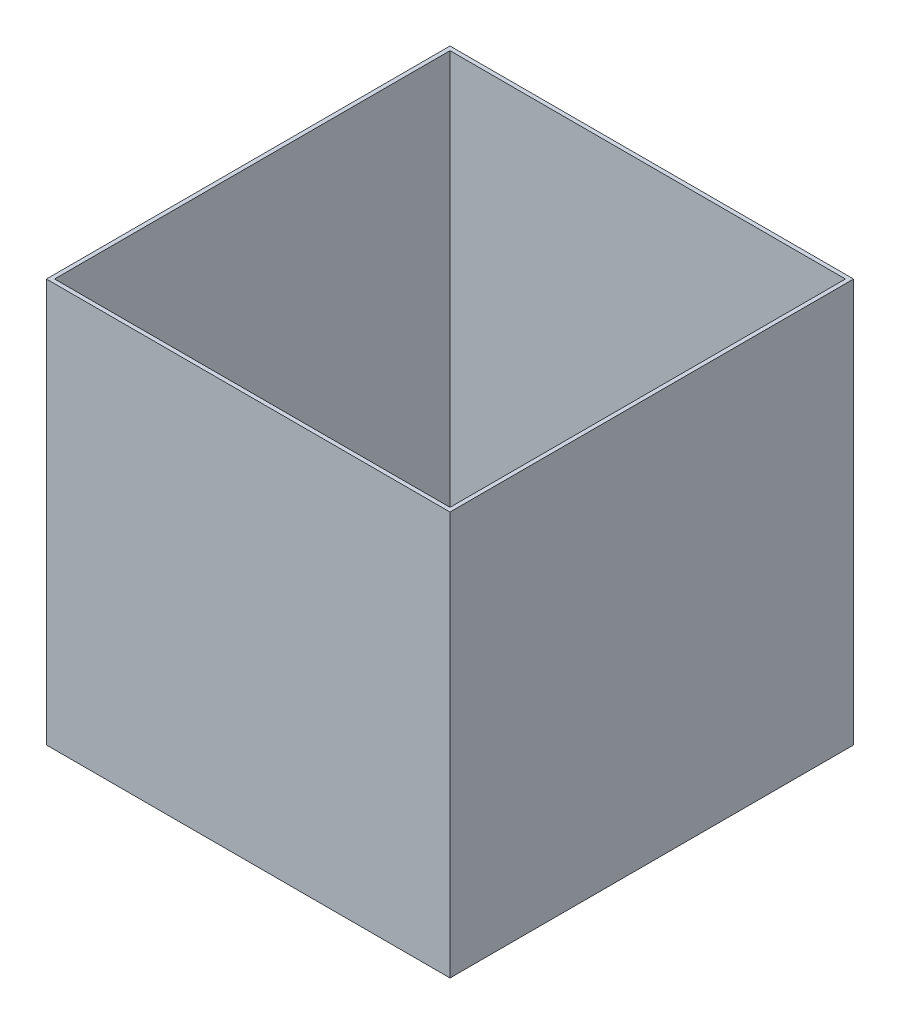
ISO-10303-21;
HEADER;
FILE_DESCRIPTION(('STEP AP214'),'2;1');
FILE_NAME('part.step','',(''),(''),'','','');
FILE_SCHEMA(('AUTOMOTIVE_DESIGN { 1 0 10303 214 1 1 1 1 }'));
ENDSEC;
DATA;
#1=APPLICATION_CONTEXT('core data for automotive mechanical design processes');
#2=APPLICATION_PROTOCOL_DEFINITION('international standard','automotive_design',2000,#1);
#3=PRODUCT_CONTEXT('',#1,'mechanical');
#4=PRODUCT('Part','Part','',(#3));
#5=PRODUCT_RELATED_PRODUCT_CATEGORY('part','',(#4));
#6=PRODUCT_DEFINITION_FORMATION('','',#4);
#7=PRODUCT_DEFINITION_CONTEXT('part definition',#1,'design');
#8=PRODUCT_DEFINITION('design','',#6,#7);
#9=PRODUCT_DEFINITION_SHAPE('','',#8);
#10=(LENGTH_UNIT() NAMED_UNIT(*) SI_UNIT(.MILLI.,.METRE.));
#11=(NAMED_UNIT(*) PLANE_ANGLE_UNIT() SI_UNIT($,.RADIAN.));
#12=(NAMED_UNIT(*) SI_UNIT($,.STERADIAN.) SOLID_ANGLE_UNIT());
#13=UNCERTAINTY_MEASURE_WITH_UNIT(LENGTH_MEASURE(1.E-05),#10,'distance_accuracy_value','');
#14=(GEOMETRIC_REPRESENTATION_CONTEXT(3) GLOBAL_UNCERTAINTY_ASSIGNED_CONTEXT((#13)) GLOBAL_UNIT_ASSIGNED_CONTEXT((#10,
#11,#12)) REPRESENTATION_CONTEXT('',''));
#15=CARTESIAN_POINT('',(0.,0.,0.));
#16=DIRECTION('',(0.,0.,1.));
#17=DIRECTION('',(1.,0.,0.));
#18=AXIS2_PLACEMENT_3D('',#15,#16,#17);
#19=CARTESIAN_POINT('',(25.,50.,-25.));
#20=DIRECTION('',(-1.,0.,0.));
#21=DIRECTION('',(0.,0.,1.));
#22=AXIS2_PLACEMENT_3D('',#19,#20,#21);
#23=PLANE('',#22);
#24=DIRECTION('',(0.,0.,-1.));
#25=VECTOR('',#24,1.);
#26=CARTESIAN_POINT('',(25.,0.,-25.));
#27=LINE('',#26,#25);
#28=CARTESIAN_POINT('',(25.,0.,25.));
#29=VERTEX_POINT('',#28);
#30=CARTESIAN_POINT('',(25.,0.,-25.));
#31=VERTEX_POINT('',#30);
#32=EDGE_CURVE('E147',#29,#31,#27,.T.);
#33=ORIENTED_EDGE('',*,*,#32,.T.);
#34=DIRECTION('',(0.,-1.,0.));
#35=VECTOR('',#34,1.);
#36=CARTESIAN_POINT('',(25.,50.,-25.));
#37=LINE('',#36,#35);
#38=CARTESIAN_POINT('',(25.,50.,-25.));
#39=VERTEX_POINT('',#38);
#40=EDGE_CURVE('E11',#39,#31,#37,.T.);
#41=ORIENTED_EDGE('',*,*,#40,.F.);
#42=DIRECTION('',(0.,0.,-1.));
#43=VECTOR('',#42,1.);
#44=CARTESIAN_POINT('',(25.,50.,-25.));
#45=LINE('',#44,#43);
#46=CARTESIAN_POINT('',(25.,50.,25.));
#47=VERTEX_POINT('',#46);
#48=EDGE_CURVE('E140',#47,#39,#45,.T.);
#49=ORIENTED_EDGE('',*,*,#48,.F.);
#50=DIRECTION('',(0.,-1.,0.));
#51=VECTOR('',#50,1.);
#52=CARTESIAN_POINT('',(25.,50.,25.));
#53=LINE('',#52,#51);
#54=EDGE_CURVE('E146',#47,#29,#53,.T.);
#55=ORIENTED_EDGE('',*,*,#54,.T.);
#56=EDGE_LOOP('',(#33,#41,#49,#55));
#57=FACE_BOUND('',#56,.T.);
#58=ADVANCED_FACE('F33',(#57),#23,.F.);
#59=CARTESIAN_POINT('',(-25.,50.,-25.));
#60=DIRECTION('',(0.,0.,1.));
#61=DIRECTION('',(1.,0.,0.));
#62=AXIS2_PLACEMENT_3D('',#59,#60,#61);
#63=PLANE('',#62);
#64=DIRECTION('',(-1.,0.,0.));
#65=VECTOR('',#64,1.);
#66=CARTESIAN_POINT('',(-25.,0.,-25.));
#67=LINE('',#66,#65);
#68=CARTESIAN_POINT('',(-25.,0.,-25.));
#69=VERTEX_POINT('',#68);
#70=EDGE_CURVE('E150',#31,#69,#67,.T.);
#71=ORIENTED_EDGE('',*,*,#70,.T.);
#72=DIRECTION('',(0.,-1.,0.));
#73=VECTOR('',#72,1.);
#74=CARTESIAN_POINT('',(-25.,50.,-25.));
#75=LINE('',#74,#73);
#76=CARTESIAN_POINT('',(-25.,50.,-25.));
#77=VERTEX_POINT('',#76);
#78=EDGE_CURVE('E40',#77,#69,#75,.T.);
#79=ORIENTED_EDGE('',*,*,#78,.F.);
#80=DIRECTION('',(-1.,0.,0.));
#81=VECTOR('',#80,1.);
#82=CARTESIAN_POINT('',(-25.,50.,-25.));
#83=LINE('',#82,#81);
#84=EDGE_CURVE('E84',#39,#77,#83,.T.);
#85=ORIENTED_EDGE('',*,*,#84,.F.);
#86=ORIENTED_EDGE('',*,*,#40,.T.);
#87=EDGE_LOOP('',(#71,#79,#85,#86));
#88=FACE_BOUND('',#87,.T.);
#89=ADVANCED_FACE('F179',(#88),#63,.F.);
#90=CARTESIAN_POINT('',(-25.,50.,-25.));
#91=DIRECTION('',(1.,0.,0.));
#92=DIRECTION('',(0.,0.,-1.));
#93=AXIS2_PLACEMENT_3D('',#90,#91,#92);
#94=PLANE('',#93);
#95=DIRECTION('',(0.,0.,1.));
#96=VECTOR('',#95,1.);
#97=CARTESIAN_POINT('',(-25.,0.,-25.));
#98=LINE('',#97,#96);
#99=CARTESIAN_POINT('',(-25.,0.,25.));
#100=VERTEX_POINT('',#99);
#101=EDGE_CURVE('E152',#69,#100,#98,.T.);
#102=ORIENTED_EDGE('',*,*,#101,.T.);
#103=DIRECTION('',(0.,-1.,0.));
#104=VECTOR('',#103,1.);
#105=CARTESIAN_POINT('',(-25.,50.,25.));
#106=LINE('',#105,#104);
#107=CARTESIAN_POINT('',(-25.,50.,25.));
#108=VERTEX_POINT('',#107);
#109=EDGE_CURVE('E156',#108,#100,#106,.T.);
#110=ORIENTED_EDGE('',*,*,#109,.F.);
#111=DIRECTION('',(0.,0.,1.));
#112=VECTOR('',#111,1.);
#113=CARTESIAN_POINT('',(-25.,50.,-25.));
#114=LINE('',#113,#112);
#115=EDGE_CURVE('E143',#77,#108,#114,.T.);
#116=ORIENTED_EDGE('',*,*,#115,.F.);
#117=ORIENTED_EDGE('',*,*,#78,.T.);
#118=EDGE_LOOP('',(#102,#110,#116,#117));
#119=FACE_BOUND('',#118,.T.);
#120=ADVANCED_FACE('F161',(#119),#94,.F.);
#121=CARTESIAN_POINT('',(-25.,50.,25.));
#122=DIRECTION('',(0.,0.,-1.));
#123=DIRECTION('',(-1.,0.,0.));
#124=AXIS2_PLACEMENT_3D('',#121,#122,#123);
#125=PLANE('',#124);
#126=DIRECTION('',(1.,0.,0.));
#127=VECTOR('',#126,1.);
#128=CARTESIAN_POINT('',(-25.,0.,25.));
#129=LINE('',#128,#127);
#130=EDGE_CURVE('E77',#100,#29,#129,.T.);
#131=ORIENTED_EDGE('',*,*,#130,.T.);
#132=ORIENTED_EDGE('',*,*,#54,.F.);
#133=DIRECTION('',(1.,0.,0.));
#134=VECTOR('',#133,1.);
#135=CARTESIAN_POINT('',(-25.,50.,25.));
#136=LINE('',#135,#134);
#137=EDGE_CURVE('E56',#108,#47,#136,.T.);
#138=ORIENTED_EDGE('',*,*,#137,.F.);
#139=ORIENTED_EDGE('',*,*,#109,.T.);
#140=EDGE_LOOP('',(#131,#132,#138,#139));
#141=FACE_BOUND('',#140,.T.);
#142=ADVANCED_FACE('F169',(#141),#125,.F.);
#143=CARTESIAN_POINT('',(0.,50.,0.));
#144=DIRECTION('',(0.,1.,0.));
#145=DIRECTION('',(0.,0.,1.));
#146=AXIS2_PLACEMENT_3D('',#143,#144,#145);
#147=PLANE('',#146);
#148=DIRECTION('',(0.,0.,-1.));
#149=VECTOR('',#148,1.);
#150=CARTESIAN_POINT('',(24.5,50.,-25.));
#151=LINE('',#150,#149);
#152=CARTESIAN_POINT('',(24.5,50.,24.5));
#153=VERTEX_POINT('',#152);
#154=CARTESIAN_POINT('',(24.5,50.,-24.5));
#155=VERTEX_POINT('',#154);
#156=EDGE_CURVE('E129',#153,#155,#151,.T.);
#157=ORIENTED_EDGE('',*,*,#156,.F.);
#158=DIRECTION('',(1.,0.,0.));
#159=VECTOR('',#158,1.);
#160=CARTESIAN_POINT('',(-25.,50.,24.5));
#161=LINE('',#160,#159);
#162=CARTESIAN_POINT('',(-24.5,50.,24.5));
#163=VERTEX_POINT('',#162);
#164=EDGE_CURVE('E138',#163,#153,#161,.T.);
#165=ORIENTED_EDGE('',*,*,#164,.F.);
#166=DIRECTION('',(0.,0.,1.));
#167=VECTOR('',#166,1.);
#168=CARTESIAN_POINT('',(-24.5,50.,-25.));
#169=LINE('',#168,#167);
#170=CARTESIAN_POINT('',(-24.5,50.,-24.5));
#171=VERTEX_POINT('',#170);
#172=EDGE_CURVE('E136',#171,#163,#169,.T.);
#173=ORIENTED_EDGE('',*,*,#172,.F.);
#174=DIRECTION('',(-1.,0.,0.));
#175=VECTOR('',#174,1.);
#176=CARTESIAN_POINT('',(-25.,50.,-24.5));
#177=LINE('',#176,#175);
#178=EDGE_CURVE('E121',#155,#171,#177,.T.);
#179=ORIENTED_EDGE('',*,*,#178,.F.);
#180=EDGE_LOOP('',(#157,#165,#173,#179));
#181=FACE_BOUND('',#180,.T.);
#182=ORIENTED_EDGE('',*,*,#48,.T.);
#183=ORIENTED_EDGE('',*,*,#84,.T.);
#184=ORIENTED_EDGE('',*,*,#115,.T.);
#185=ORIENTED_EDGE('',*,*,#137,.T.);
#186=EDGE_LOOP('',(#182,#183,#184,#185));
#187=FACE_BOUND('',#186,.T.);
#188=ADVANCED_FACE('F171',(#181,#187),#147,.T.);
#189=CARTESIAN_POINT('',(0.,0.,0.));
#190=DIRECTION('',(0.,1.,0.));
#191=DIRECTION('',(0.,0.,1.));
#192=AXIS2_PLACEMENT_3D('',#189,#190,#191);
#193=PLANE('',#192);
#194=ORIENTED_EDGE('',*,*,#32,.F.);
#195=ORIENTED_EDGE('',*,*,#130,.F.);
#196=ORIENTED_EDGE('',*,*,#101,.F.);
#197=ORIENTED_EDGE('',*,*,#70,.F.);
#198=EDGE_LOOP('',(#194,#195,#196,#197));
#199=FACE_BOUND('',#198,.T.);
#200=ADVANCED_FACE('F165',(#199),#193,.F.);
#201=CARTESIAN_POINT('',(24.5,50.,-25.));
#202=DIRECTION('',(-1.,0.,0.));
#203=DIRECTION('',(0.,0.,1.));
#204=AXIS2_PLACEMENT_3D('',#201,#202,#203);
#205=PLANE('',#204);
#206=DIRECTION('',(0.,0.,-1.));
#207=VECTOR('',#206,1.);
#208=CARTESIAN_POINT('',(24.5,0.5,-25.));
#209=LINE('',#208,#207);
#210=CARTESIAN_POINT('',(24.5,0.5,24.5));
#211=VERTEX_POINT('',#210);
#212=CARTESIAN_POINT('',(24.5,0.5,-24.5));
#213=VERTEX_POINT('',#212);
#214=EDGE_CURVE('E112',#211,#213,#209,.T.);
#215=ORIENTED_EDGE('',*,*,#214,.F.);
#216=DIRECTION('',(0.,-1.,0.));
#217=VECTOR('',#216,1.);
#218=CARTESIAN_POINT('',(24.5,50.,24.5));
#219=LINE('',#218,#217);
#220=EDGE_CURVE('E132',#153,#211,#219,.T.);
#221=ORIENTED_EDGE('',*,*,#220,.F.);
#222=ORIENTED_EDGE('',*,*,#156,.T.);
#223=DIRECTION('',(0.,-1.,0.));
#224=VECTOR('',#223,1.);
#225=CARTESIAN_POINT('',(24.5,50.,-24.5));
#226=LINE('',#225,#224);
#227=EDGE_CURVE('E124',#155,#213,#226,.T.);
#228=ORIENTED_EDGE('',*,*,#227,.T.);
#229=EDGE_LOOP('',(#215,#221,#222,#228));
#230=FACE_BOUND('',#229,.T.);
#231=ADVANCED_FACE('F206',(#230),#205,.T.);
#232=CARTESIAN_POINT('',(-25.,50.,-24.5));
#233=DIRECTION('',(0.,0.,1.));
#234=DIRECTION('',(1.,0.,0.));
#235=AXIS2_PLACEMENT_3D('',#232,#233,#234);
#236=PLANE('',#235);
#237=DIRECTION('',(-1.,0.,0.));
#238=VECTOR('',#237,1.);
#239=CARTESIAN_POINT('',(-25.,0.5,-24.5));
#240=LINE('',#239,#238);
#241=CARTESIAN_POINT('',(-24.5,0.5,-24.5));
#242=VERTEX_POINT('',#241);
#243=EDGE_CURVE('E106',#213,#242,#240,.T.);
#244=ORIENTED_EDGE('',*,*,#243,.F.);
#245=ORIENTED_EDGE('',*,*,#227,.F.);
#246=ORIENTED_EDGE('',*,*,#178,.T.);
#247=DIRECTION('',(0.,-1.,0.));
#248=VECTOR('',#247,1.);
#249=CARTESIAN_POINT('',(-24.5,50.,-24.5));
#250=LINE('',#249,#248);
#251=EDGE_CURVE('E118',#171,#242,#250,.T.);
#252=ORIENTED_EDGE('',*,*,#251,.T.);
#253=EDGE_LOOP('',(#244,#245,#246,#252));
#254=FACE_BOUND('',#253,.T.);
#255=ADVANCED_FACE('F119',(#254),#236,.T.);
#256=CARTESIAN_POINT('',(-24.5,50.,-25.));
#257=DIRECTION('',(1.,0.,0.));
#258=DIRECTION('',(0.,0.,-1.));
#259=AXIS2_PLACEMENT_3D('',#256,#257,#258);
#260=PLANE('',#259);
#261=DIRECTION('',(0.,0.,1.));
#262=VECTOR('',#261,1.);
#263=CARTESIAN_POINT('',(-24.5,0.5,-25.));
#264=LINE('',#263,#262);
#265=CARTESIAN_POINT('',(-24.5,0.5,24.5));
#266=VERTEX_POINT('',#265);
#267=EDGE_CURVE('E110',#242,#266,#264,.T.);
#268=ORIENTED_EDGE('',*,*,#267,.F.);
#269=ORIENTED_EDGE('',*,*,#251,.F.);
#270=ORIENTED_EDGE('',*,*,#172,.T.);
#271=DIRECTION('',(0.,-1.,0.));
#272=VECTOR('',#271,1.);
#273=CARTESIAN_POINT('',(-24.5,50.,24.5));
#274=LINE('',#273,#272);
#275=EDGE_CURVE('E47',#163,#266,#274,.T.);
#276=ORIENTED_EDGE('',*,*,#275,.T.);
#277=EDGE_LOOP('',(#268,#269,#270,#276));
#278=FACE_BOUND('',#277,.T.);
#279=ADVANCED_FACE('F126',(#278),#260,.T.);
#280=CARTESIAN_POINT('',(-25.,50.,24.5));
#281=DIRECTION('',(0.,0.,-1.));
#282=DIRECTION('',(-1.,0.,0.));
#283=AXIS2_PLACEMENT_3D('',#280,#281,#282);
#284=PLANE('',#283);
#285=DIRECTION('',(1.,0.,0.));
#286=VECTOR('',#285,1.);
#287=CARTESIAN_POINT('',(-25.,0.5,24.5));
#288=LINE('',#287,#286);
#289=EDGE_CURVE('E127',#266,#211,#288,.T.);
#290=ORIENTED_EDGE('',*,*,#289,.F.);
#291=ORIENTED_EDGE('',*,*,#275,.F.);
#292=ORIENTED_EDGE('',*,*,#164,.T.);
#293=ORIENTED_EDGE('',*,*,#220,.T.);
#294=EDGE_LOOP('',(#290,#291,#292,#293));
#295=FACE_BOUND('',#294,.T.);
#296=ADVANCED_FACE('F236',(#295),#284,.T.);
#297=CARTESIAN_POINT('',(0.,0.5,0.));
#298=DIRECTION('',(0.,1.,0.));
#299=DIRECTION('',(0.,0.,1.));
#300=AXIS2_PLACEMENT_3D('',#297,#298,#299);
#301=PLANE('',#300);
#302=ORIENTED_EDGE('',*,*,#214,.T.);
#303=ORIENTED_EDGE('',*,*,#243,.T.);
#304=ORIENTED_EDGE('',*,*,#267,.T.);
#305=ORIENTED_EDGE('',*,*,#289,.T.);
#306=EDGE_LOOP('',(#302,#303,#304,#305));
#307=FACE_BOUND('',#306,.T.);
#308=ADVANCED_FACE('F108',(#307),#301,.T.);
#309=CLOSED_SHELL('',(#58,#89,#120,#142,#188,#200,#231,#255,#279,#296,#308));
#310=MANIFOLD_SOLID_BREP('B2',#309);
#311=ADVANCED_BREP_SHAPE_REPRESENTATION('',(#18,#310),#14);
#312=SHAPE_DEFINITION_REPRESENTATION(#9,#311);
ENDSEC;
END-ISO-10303-21;
